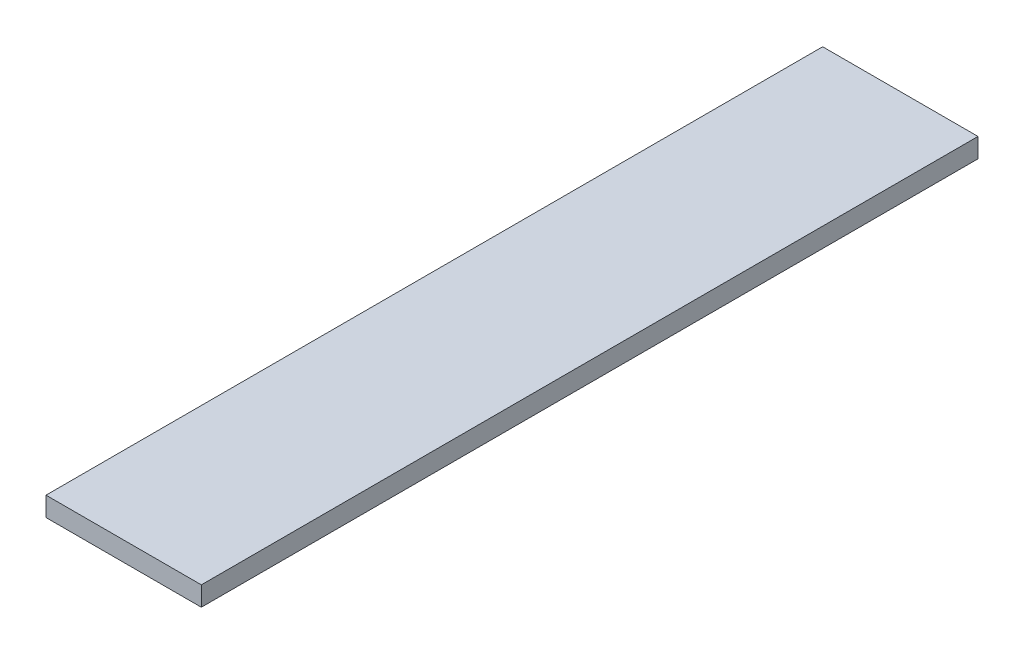
ISO-10303-21;
HEADER;
FILE_DESCRIPTION(('STEP AP214'),'2;1');
FILE_NAME('part.step','',(''),(''),'','','');
FILE_SCHEMA(('AUTOMOTIVE_DESIGN { 1 0 10303 214 1 1 1 1 }'));
ENDSEC;
DATA;
#1=APPLICATION_CONTEXT('core data for automotive mechanical design processes');
#2=APPLICATION_PROTOCOL_DEFINITION('international standard','automotive_design',2000,#1);
#3=PRODUCT_CONTEXT('',#1,'mechanical');
#4=PRODUCT('Part','Part','',(#3));
#5=PRODUCT_RELATED_PRODUCT_CATEGORY('part','',(#4));
#6=PRODUCT_DEFINITION_FORMATION('','',#4);
#7=PRODUCT_DEFINITION_CONTEXT('part definition',#1,'design');
#8=PRODUCT_DEFINITION('design','',#6,#7);
#9=PRODUCT_DEFINITION_SHAPE('','',#8);
#10=(LENGTH_UNIT() NAMED_UNIT(*) SI_UNIT(.MILLI.,.METRE.));
#11=(NAMED_UNIT(*) PLANE_ANGLE_UNIT() SI_UNIT($,.RADIAN.));
#12=(NAMED_UNIT(*) SI_UNIT($,.STERADIAN.) SOLID_ANGLE_UNIT());
#13=UNCERTAINTY_MEASURE_WITH_UNIT(LENGTH_MEASURE(1.E-05),#10,'distance_accuracy_value','');
#14=(GEOMETRIC_REPRESENTATION_CONTEXT(3) GLOBAL_UNCERTAINTY_ASSIGNED_CONTEXT((#13)) GLOBAL_UNIT_ASSIGNED_CONTEXT((#10,
#11,#12)) REPRESENTATION_CONTEXT('',''));
#15=CARTESIAN_POINT('',(0.,0.,0.));
#16=DIRECTION('',(0.,0.,1.));
#17=DIRECTION('',(1.,0.,0.));
#18=AXIS2_PLACEMENT_3D('',#15,#16,#17);
#19=CARTESIAN_POINT('',(0.,3.175,0.));
#20=DIRECTION('',(1.,0.,0.));
#21=DIRECTION('',(0.,0.,-1.));
#22=AXIS2_PLACEMENT_3D('',#19,#20,#21);
#23=PLANE('',#22);
#24=DIRECTION('',(0.,0.,1.));
#25=VECTOR('',#24,1.);
#26=CARTESIAN_POINT('',(0.,0.,0.));
#27=LINE('',#26,#25);
#28=CARTESIAN_POINT('',(0.,0.,-127.));
#29=VERTEX_POINT('',#28);
#30=CARTESIAN_POINT('',(0.,0.,0.));
#31=VERTEX_POINT('',#30);
#32=EDGE_CURVE('E96',#29,#31,#27,.T.);
#33=ORIENTED_EDGE('',*,*,#32,.T.);
#34=DIRECTION('',(0.,-1.,0.));
#35=VECTOR('',#34,1.);
#36=CARTESIAN_POINT('',(0.,3.175,0.));
#37=LINE('',#36,#35);
#38=CARTESIAN_POINT('',(0.,3.175,0.));
#39=VERTEX_POINT('',#38);
#40=EDGE_CURVE('E11',#39,#31,#37,.T.);
#41=ORIENTED_EDGE('',*,*,#40,.F.);
#42=DIRECTION('',(0.,0.,1.));
#43=VECTOR('',#42,1.);
#44=CARTESIAN_POINT('',(0.,3.175,0.));
#45=LINE('',#44,#43);
#46=CARTESIAN_POINT('',(0.,3.175,-127.));
#47=VERTEX_POINT('',#46);
#48=EDGE_CURVE('E84',#47,#39,#45,.T.);
#49=ORIENTED_EDGE('',*,*,#48,.F.);
#50=DIRECTION('',(0.,-1.,0.));
#51=VECTOR('',#50,1.);
#52=CARTESIAN_POINT('',(0.,3.175,-127.));
#53=LINE('',#52,#51);
#54=EDGE_CURVE('E92',#47,#29,#53,.T.);
#55=ORIENTED_EDGE('',*,*,#54,.T.);
#56=EDGE_LOOP('',(#33,#41,#49,#55));
#57=FACE_BOUND('',#56,.T.);
#58=ADVANCED_FACE('F33',(#57),#23,.F.);
#59=CARTESIAN_POINT('',(0.,3.175,0.));
#60=DIRECTION('',(0.,0.,-1.));
#61=DIRECTION('',(-1.,0.,0.));
#62=AXIS2_PLACEMENT_3D('',#59,#60,#61);
#63=PLANE('',#62);
#64=DIRECTION('',(1.,0.,0.));
#65=VECTOR('',#64,1.);
#66=CARTESIAN_POINT('',(0.,0.,0.));
#67=LINE('',#66,#65);
#68=CARTESIAN_POINT('',(25.4,0.,0.));
#69=VERTEX_POINT('',#68);
#70=EDGE_CURVE('E88',#31,#69,#67,.T.);
#71=ORIENTED_EDGE('',*,*,#70,.T.);
#72=DIRECTION('',(0.,-1.,0.));
#73=VECTOR('',#72,1.);
#74=CARTESIAN_POINT('',(25.4,3.175,0.));
#75=LINE('',#74,#73);
#76=CARTESIAN_POINT('',(25.4,3.175,0.));
#77=VERTEX_POINT('',#76);
#78=EDGE_CURVE('E41',#77,#69,#75,.T.);
#79=ORIENTED_EDGE('',*,*,#78,.F.);
#80=DIRECTION('',(1.,0.,0.));
#81=VECTOR('',#80,1.);
#82=CARTESIAN_POINT('',(0.,3.175,0.));
#83=LINE('',#82,#81);
#84=EDGE_CURVE('E79',#39,#77,#83,.T.);
#85=ORIENTED_EDGE('',*,*,#84,.F.);
#86=ORIENTED_EDGE('',*,*,#40,.T.);
#87=EDGE_LOOP('',(#71,#79,#85,#86));
#88=FACE_BOUND('',#87,.T.);
#89=ADVANCED_FACE('F87',(#88),#63,.F.);
#90=CARTESIAN_POINT('',(25.4,3.175,0.));
#91=DIRECTION('',(-1.,0.,0.));
#92=DIRECTION('',(0.,0.,1.));
#93=AXIS2_PLACEMENT_3D('',#90,#91,#92);
#94=PLANE('',#93);
#95=DIRECTION('',(0.,0.,-1.));
#96=VECTOR('',#95,1.);
#97=CARTESIAN_POINT('',(25.4,0.,0.));
#98=LINE('',#97,#96);
#99=CARTESIAN_POINT('',(25.4,0.,-127.));
#100=VERTEX_POINT('',#99);
#101=EDGE_CURVE('E66',#69,#100,#98,.T.);
#102=ORIENTED_EDGE('',*,*,#101,.T.);
#103=DIRECTION('',(0.,-1.,0.));
#104=VECTOR('',#103,1.);
#105=CARTESIAN_POINT('',(25.4,3.175,-127.));
#106=LINE('',#105,#104);
#107=CARTESIAN_POINT('',(25.4,3.175,-127.));
#108=VERTEX_POINT('',#107);
#109=EDGE_CURVE('E89',#108,#100,#106,.T.);
#110=ORIENTED_EDGE('',*,*,#109,.F.);
#111=DIRECTION('',(0.,0.,-1.));
#112=VECTOR('',#111,1.);
#113=CARTESIAN_POINT('',(25.4,3.175,0.));
#114=LINE('',#113,#112);
#115=EDGE_CURVE('E82',#77,#108,#114,.T.);
#116=ORIENTED_EDGE('',*,*,#115,.F.);
#117=ORIENTED_EDGE('',*,*,#78,.T.);
#118=EDGE_LOOP('',(#102,#110,#116,#117));
#119=FACE_BOUND('',#118,.T.);
#120=ADVANCED_FACE('F90',(#119),#94,.F.);
#121=CARTESIAN_POINT('',(0.,3.175,-127.));
#122=DIRECTION('',(0.,0.,1.));
#123=DIRECTION('',(1.,0.,0.));
#124=AXIS2_PLACEMENT_3D('',#121,#122,#123);
#125=PLANE('',#124);
#126=DIRECTION('',(-1.,0.,0.));
#127=VECTOR('',#126,1.);
#128=CARTESIAN_POINT('',(0.,0.,-127.));
#129=LINE('',#128,#127);
#130=EDGE_CURVE('E72',#100,#29,#129,.T.);
#131=ORIENTED_EDGE('',*,*,#130,.T.);
#132=ORIENTED_EDGE('',*,*,#54,.F.);
#133=DIRECTION('',(-1.,0.,0.));
#134=VECTOR('',#133,1.);
#135=CARTESIAN_POINT('',(0.,3.175,-127.));
#136=LINE('',#135,#134);
#137=EDGE_CURVE('E49',#108,#47,#136,.T.);
#138=ORIENTED_EDGE('',*,*,#137,.F.);
#139=ORIENTED_EDGE('',*,*,#109,.T.);
#140=EDGE_LOOP('',(#131,#132,#138,#139));
#141=FACE_BOUND('',#140,.T.);
#142=ADVANCED_FACE('F103',(#141),#125,.F.);
#143=CARTESIAN_POINT('',(0.,3.175,0.));
#144=DIRECTION('',(0.,-1.,0.));
#145=DIRECTION('',(0.,0.,-1.));
#146=AXIS2_PLACEMENT_3D('',#143,#144,#145);
#147=PLANE('',#146);
#148=ORIENTED_EDGE('',*,*,#48,.T.);
#149=ORIENTED_EDGE('',*,*,#84,.T.);
#150=ORIENTED_EDGE('',*,*,#115,.T.);
#151=ORIENTED_EDGE('',*,*,#137,.T.);
#152=EDGE_LOOP('',(#148,#149,#150,#151));
#153=FACE_BOUND('',#152,.T.);
#154=ADVANCED_FACE('F80',(#153),#147,.F.);
#155=CARTESIAN_POINT('',(0.,0.,0.));
#156=DIRECTION('',(0.,-1.,0.));
#157=DIRECTION('',(0.,0.,-1.));
#158=AXIS2_PLACEMENT_3D('',#155,#156,#157);
#159=PLANE('',#158);
#160=ORIENTED_EDGE('',*,*,#32,.F.);
#161=ORIENTED_EDGE('',*,*,#130,.F.);
#162=ORIENTED_EDGE('',*,*,#101,.F.);
#163=ORIENTED_EDGE('',*,*,#70,.F.);
#164=EDGE_LOOP('',(#160,#161,#162,#163));
#165=FACE_BOUND('',#164,.T.);
#166=ADVANCED_FACE('F106',(#165),#159,.T.);
#167=CLOSED_SHELL('',(#58,#89,#120,#142,#154,#166));
#168=MANIFOLD_SOLID_BREP('B2',#167);
#169=ADVANCED_BREP_SHAPE_REPRESENTATION('',(#18,#168),#14);
#170=SHAPE_DEFINITION_REPRESENTATION(#9,#169);
ENDSEC;
END-ISO-10303-21;
